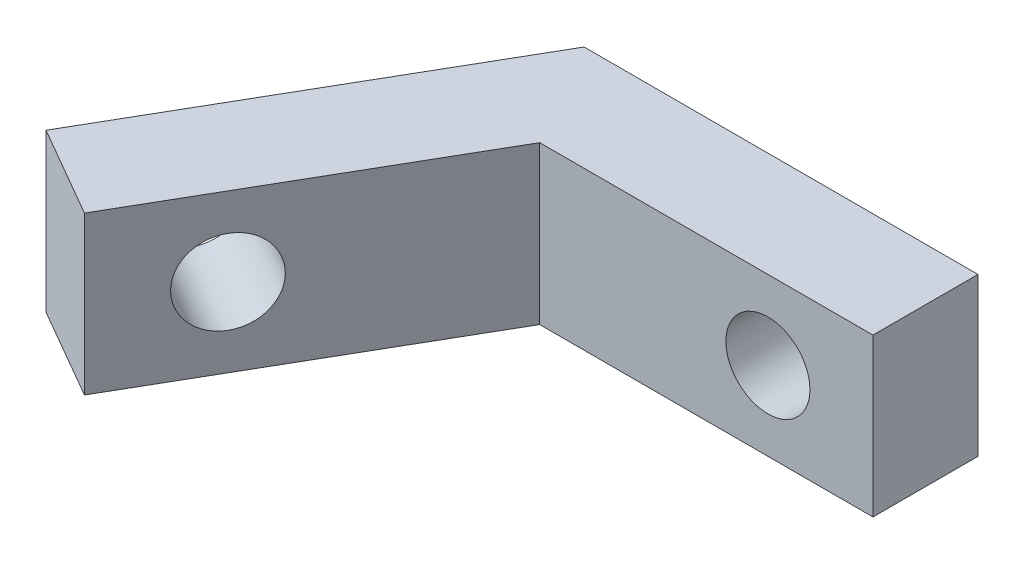
ISO-10303-21;
HEADER;
FILE_DESCRIPTION(('STEP AP214'),'2;1');
FILE_NAME('part.step','',(''),(''),'','','');
FILE_SCHEMA(('AUTOMOTIVE_DESIGN { 1 0 10303 214 1 1 1 1 }'));
ENDSEC;
DATA;
#1=APPLICATION_CONTEXT('core data for automotive mechanical design processes');
#2=APPLICATION_PROTOCOL_DEFINITION('international standard','automotive_design',2000,#1);
#3=PRODUCT_CONTEXT('',#1,'mechanical');
#4=PRODUCT('Part','Part','',(#3));
#5=PRODUCT_RELATED_PRODUCT_CATEGORY('part','',(#4));
#6=PRODUCT_DEFINITION_FORMATION('','',#4);
#7=PRODUCT_DEFINITION_CONTEXT('part definition',#1,'design');
#8=PRODUCT_DEFINITION('design','',#6,#7);
#9=PRODUCT_DEFINITION_SHAPE('','',#8);
#10=(LENGTH_UNIT() NAMED_UNIT(*) SI_UNIT(.MILLI.,.METRE.));
#11=(NAMED_UNIT(*) PLANE_ANGLE_UNIT() SI_UNIT($,.RADIAN.));
#12=(NAMED_UNIT(*) SI_UNIT($,.STERADIAN.) SOLID_ANGLE_UNIT());
#13=UNCERTAINTY_MEASURE_WITH_UNIT(LENGTH_MEASURE(1.E-05),#10,'distance_accuracy_value','');
#14=(GEOMETRIC_REPRESENTATION_CONTEXT(3) GLOBAL_UNCERTAINTY_ASSIGNED_CONTEXT((#13)) GLOBAL_UNIT_ASSIGNED_CONTEXT((#10,
#11,#12)) REPRESENTATION_CONTEXT('',''));
#15=CARTESIAN_POINT('',(0.,0.,0.));
#16=DIRECTION('',(0.,0.,1.));
#17=DIRECTION('',(1.,0.,0.));
#18=AXIS2_PLACEMENT_3D('',#15,#16,#17);
#19=CARTESIAN_POINT('',(-7.49999999999996,6.,12.9903810567666));
#20=DIRECTION('',(0.86602540378444,0.,0.499999999999998));
#21=DIRECTION('',(0.499999999999998,0.,-0.86602540378444));
#22=AXIS2_PLACEMENT_3D('',#19,#20,#21);
#23=PLANE('',#22);
#24=CARTESIAN_POINT('',(-5.49999999999997,3.,9.52627944162884));
#25=DIRECTION('',(0.86602540378444,0.,0.499999999999998));
#26=DIRECTION('',(0.499999999999998,0.,-0.86602540378444));
#27=AXIS2_PLACEMENT_3D('',#24,#25,#26);
#28=CIRCLE('',#27,1.6);
#29=CARTESIAN_POINT('',(-4.69999999999998,3.,8.14063879557373));
#30=VERTEX_POINT('',#29);
#31=EDGE_CURVE('E123',#30,#30,#28,.F.);
#32=ORIENTED_EDGE('',*,*,#31,.F.);
#33=EDGE_LOOP('',(#32));
#34=FACE_BOUND('',#33,.T.);
#35=DIRECTION('',(-0.499999999999998,0.,0.86602540378444));
#36=VECTOR('',#35,1.);
#37=CARTESIAN_POINT('',(-7.49999999999996,0.,12.9903810567666));
#38=LINE('',#37,#36);
#39=CARTESIAN_POINT('',(0.,0.,0.));
#40=VERTEX_POINT('',#39);
#41=CARTESIAN_POINT('',(-7.49999999999996,0.,12.9903810567666));
#42=VERTEX_POINT('',#41);
#43=EDGE_CURVE('E119',#40,#42,#38,.T.);
#44=ORIENTED_EDGE('',*,*,#43,.T.);
#45=DIRECTION('',(0.,-1.,0.));
#46=VECTOR('',#45,1.);
#47=CARTESIAN_POINT('',(-7.49999999999996,6.,12.9903810567666));
#48=LINE('',#47,#46);
#49=CARTESIAN_POINT('',(-7.49999999999996,6.,12.9903810567666));
#50=VERTEX_POINT('',#49);
#51=EDGE_CURVE('E11',#50,#42,#48,.T.);
#52=ORIENTED_EDGE('',*,*,#51,.F.);
#53=DIRECTION('',(-0.499999999999998,0.,0.86602540378444));
#54=VECTOR('',#53,1.);
#55=CARTESIAN_POINT('',(-7.49999999999996,6.,12.9903810567666));
#56=LINE('',#55,#54);
#57=CARTESIAN_POINT('',(0.,6.,0.));
#58=VERTEX_POINT('',#57);
#59=EDGE_CURVE('E130',#58,#50,#56,.T.);
#60=ORIENTED_EDGE('',*,*,#59,.F.);
#61=DIRECTION('',(0.,-1.,0.));
#62=VECTOR('',#61,1.);
#63=CARTESIAN_POINT('',(0.,6.,0.));
#64=LINE('',#63,#62);
#65=EDGE_CURVE('E115',#58,#40,#64,.T.);
#66=ORIENTED_EDGE('',*,*,#65,.T.);
#67=EDGE_LOOP('',(#44,#52,#60,#66));
#68=FACE_BOUND('',#67,.T.);
#69=ADVANCED_FACE('F34',(#34,#68),#23,.F.);
#70=CARTESIAN_POINT('',(-4.0358983848622,6.,14.9903810567666));
#71=DIRECTION('',(0.499999999999997,0.,-0.86602540378444));
#72=DIRECTION('',(-0.86602540378444,0.,-0.499999999999997));
#73=AXIS2_PLACEMENT_3D('',#70,#71,#72);
#74=PLANE('',#73);
#75=DIRECTION('',(0.86602540378444,0.,0.499999999999997));
#76=VECTOR('',#75,1.);
#77=CARTESIAN_POINT('',(-4.0358983848622,0.,14.9903810567666));
#78=LINE('',#77,#76);
#79=CARTESIAN_POINT('',(-4.0358983848622,0.,14.9903810567666));
#80=VERTEX_POINT('',#79);
#81=EDGE_CURVE('E122',#42,#80,#78,.T.);
#82=ORIENTED_EDGE('',*,*,#81,.T.);
#83=DIRECTION('',(0.,-1.,0.));
#84=VECTOR('',#83,1.);
#85=CARTESIAN_POINT('',(-4.0358983848622,6.,14.9903810567666));
#86=LINE('',#85,#84);
#87=CARTESIAN_POINT('',(-4.0358983848622,6.,14.9903810567666));
#88=VERTEX_POINT('',#87);
#89=EDGE_CURVE('E43',#88,#80,#86,.T.);
#90=ORIENTED_EDGE('',*,*,#89,.F.);
#91=DIRECTION('',(0.86602540378444,0.,0.499999999999997));
#92=VECTOR('',#91,1.);
#93=CARTESIAN_POINT('',(-4.0358983848622,6.,14.9903810567666));
#94=LINE('',#93,#92);
#95=EDGE_CURVE('E88',#50,#88,#94,.T.);
#96=ORIENTED_EDGE('',*,*,#95,.F.);
#97=ORIENTED_EDGE('',*,*,#51,.T.);
#98=EDGE_LOOP('',(#82,#90,#96,#97));
#99=FACE_BOUND('',#98,.T.);
#100=ADVANCED_FACE('F157',(#99),#74,.F.);
#101=CARTESIAN_POINT('',(2.30940107675851,6.,4.));
#102=DIRECTION('',(-0.86602540378444,0.,-0.499999999999998));
#103=DIRECTION('',(-0.499999999999998,0.,0.86602540378444));
#104=AXIS2_PLACEMENT_3D('',#101,#102,#103);
#105=PLANE('',#104);
#106=CARTESIAN_POINT('',(-2.03589838486221,3.,11.5262794416288));
#107=DIRECTION('',(-0.86602540378444,0.,-0.499999999999998));
#108=DIRECTION('',(-0.499999999999998,0.,0.86602540378444));
#109=AXIS2_PLACEMENT_3D('',#106,#107,#108);
#110=CIRCLE('',#109,1.6);
#111=CARTESIAN_POINT('',(-2.83589838486221,3.,12.9119200876839));
#112=VERTEX_POINT('',#111);
#113=EDGE_CURVE('E165',#112,#112,#110,.F.);
#114=ORIENTED_EDGE('',*,*,#113,.F.);
#115=EDGE_LOOP('',(#114));
#116=FACE_BOUND('',#115,.T.);
#117=DIRECTION('',(0.499999999999998,0.,-0.86602540378444));
#118=VECTOR('',#117,1.);
#119=CARTESIAN_POINT('',(2.30940107675851,0.,4.));
#120=LINE('',#119,#118);
#121=CARTESIAN_POINT('',(2.30940107675851,0.,4.));
#122=VERTEX_POINT('',#121);
#123=EDGE_CURVE('E125',#80,#122,#120,.T.);
#124=ORIENTED_EDGE('',*,*,#123,.T.);
#125=DIRECTION('',(0.,-1.,0.));
#126=VECTOR('',#125,1.);
#127=CARTESIAN_POINT('',(2.30940107675851,6.,4.));
#128=LINE('',#127,#126);
#129=CARTESIAN_POINT('',(2.30940107675851,6.,4.));
#130=VERTEX_POINT('',#129);
#131=EDGE_CURVE('E110',#130,#122,#128,.T.);
#132=ORIENTED_EDGE('',*,*,#131,.F.);
#133=DIRECTION('',(0.499999999999998,0.,-0.86602540378444));
#134=VECTOR('',#133,1.);
#135=CARTESIAN_POINT('',(2.30940107675851,6.,4.));
#136=LINE('',#135,#134);
#137=EDGE_CURVE('E101',#88,#130,#136,.T.);
#138=ORIENTED_EDGE('',*,*,#137,.F.);
#139=ORIENTED_EDGE('',*,*,#89,.T.);
#140=EDGE_LOOP('',(#124,#132,#138,#139));
#141=FACE_BOUND('',#140,.T.);
#142=ADVANCED_FACE('F137',(#116,#141),#105,.F.);
#143=CARTESIAN_POINT('',(15.,6.,4.));
#144=DIRECTION('',(0.,0.,-1.));
#145=DIRECTION('',(-1.,0.,0.));
#146=AXIS2_PLACEMENT_3D('',#143,#144,#145);
#147=PLANE('',#146);
#148=CARTESIAN_POINT('',(11.,3.,4.));
#149=DIRECTION('',(0.,0.,-1.));
#150=DIRECTION('',(-1.,0.,0.));
#151=AXIS2_PLACEMENT_3D('',#148,#149,#150);
#152=CIRCLE('',#151,1.6);
#153=CARTESIAN_POINT('',(12.6,3.,4.));
#154=VERTEX_POINT('',#153);
#155=EDGE_CURVE('E172',#154,#154,#152,.T.);
#156=ORIENTED_EDGE('',*,*,#155,.T.);
#157=EDGE_LOOP('',(#156));
#158=FACE_BOUND('',#157,.T.);
#159=DIRECTION('',(1.,0.,0.));
#160=VECTOR('',#159,1.);
#161=CARTESIAN_POINT('',(15.,0.,4.));
#162=LINE('',#161,#160);
#163=CARTESIAN_POINT('',(15.,0.,4.));
#164=VERTEX_POINT('',#163);
#165=EDGE_CURVE('E109',#122,#164,#162,.T.);
#166=ORIENTED_EDGE('',*,*,#165,.T.);
#167=DIRECTION('',(0.,-1.,0.));
#168=VECTOR('',#167,1.);
#169=CARTESIAN_POINT('',(15.,6.,4.));
#170=LINE('',#169,#168);
#171=CARTESIAN_POINT('',(15.,6.,4.));
#172=VERTEX_POINT('',#171);
#173=EDGE_CURVE('E106',#172,#164,#170,.T.);
#174=ORIENTED_EDGE('',*,*,#173,.F.);
#175=DIRECTION('',(1.,0.,0.));
#176=VECTOR('',#175,1.);
#177=CARTESIAN_POINT('',(15.,6.,4.));
#178=LINE('',#177,#176);
#179=EDGE_CURVE('E95',#130,#172,#178,.T.);
#180=ORIENTED_EDGE('',*,*,#179,.F.);
#181=ORIENTED_EDGE('',*,*,#131,.T.);
#182=EDGE_LOOP('',(#166,#174,#180,#181));
#183=FACE_BOUND('',#182,.T.);
#184=ADVANCED_FACE('F107',(#158,#183),#147,.F.);
#185=CARTESIAN_POINT('',(15.,6.,0.));
#186=DIRECTION('',(-1.,0.,0.));
#187=DIRECTION('',(0.,0.,1.));
#188=AXIS2_PLACEMENT_3D('',#185,#186,#187);
#189=PLANE('',#188);
#190=DIRECTION('',(0.,0.,-1.));
#191=VECTOR('',#190,1.);
#192=CARTESIAN_POINT('',(15.,0.,0.));
#193=LINE('',#192,#191);
#194=CARTESIAN_POINT('',(15.,0.,0.));
#195=VERTEX_POINT('',#194);
#196=EDGE_CURVE('E74',#164,#195,#193,.T.);
#197=ORIENTED_EDGE('',*,*,#196,.T.);
#198=DIRECTION('',(0.,-1.,0.));
#199=VECTOR('',#198,1.);
#200=CARTESIAN_POINT('',(15.,6.,0.));
#201=LINE('',#200,#199);
#202=CARTESIAN_POINT('',(15.,6.,0.));
#203=VERTEX_POINT('',#202);
#204=EDGE_CURVE('E111',#203,#195,#201,.T.);
#205=ORIENTED_EDGE('',*,*,#204,.F.);
#206=DIRECTION('',(0.,0.,-1.));
#207=VECTOR('',#206,1.);
#208=CARTESIAN_POINT('',(15.,6.,0.));
#209=LINE('',#208,#207);
#210=EDGE_CURVE('E99',#172,#203,#209,.T.);
#211=ORIENTED_EDGE('',*,*,#210,.F.);
#212=ORIENTED_EDGE('',*,*,#173,.T.);
#213=EDGE_LOOP('',(#197,#205,#211,#212));
#214=FACE_BOUND('',#213,.T.);
#215=ADVANCED_FACE('F113',(#214),#189,.F.);
#216=CARTESIAN_POINT('',(0.,6.,0.));
#217=DIRECTION('',(0.,0.,1.));
#218=DIRECTION('',(1.,0.,0.));
#219=AXIS2_PLACEMENT_3D('',#216,#217,#218);
#220=PLANE('',#219);
#221=CARTESIAN_POINT('',(11.,3.,0.));
#222=DIRECTION('',(0.,0.,1.));
#223=DIRECTION('',(1.,0.,0.));
#224=AXIS2_PLACEMENT_3D('',#221,#222,#223);
#225=CIRCLE('',#224,1.6);
#226=CARTESIAN_POINT('',(12.6,3.,0.));
#227=VERTEX_POINT('',#226);
#228=EDGE_CURVE('E37',#227,#227,#225,.T.);
#229=ORIENTED_EDGE('',*,*,#228,.T.);
#230=EDGE_LOOP('',(#229));
#231=FACE_BOUND('',#230,.T.);
#232=DIRECTION('',(-1.,0.,0.));
#233=VECTOR('',#232,1.);
#234=CARTESIAN_POINT('',(0.,0.,0.));
#235=LINE('',#234,#233);
#236=EDGE_CURVE('E80',#195,#40,#235,.T.);
#237=ORIENTED_EDGE('',*,*,#236,.T.);
#238=ORIENTED_EDGE('',*,*,#65,.F.);
#239=DIRECTION('',(-1.,0.,0.));
#240=VECTOR('',#239,1.);
#241=CARTESIAN_POINT('',(0.,6.,0.));
#242=LINE('',#241,#240);
#243=EDGE_CURVE('E51',#203,#58,#242,.T.);
#244=ORIENTED_EDGE('',*,*,#243,.F.);
#245=ORIENTED_EDGE('',*,*,#204,.T.);
#246=EDGE_LOOP('',(#237,#238,#244,#245));
#247=FACE_BOUND('',#246,.T.);
#248=ADVANCED_FACE('F144',(#231,#247),#220,.F.);
#249=CARTESIAN_POINT('',(0.,6.,0.));
#250=DIRECTION('',(0.,1.,0.));
#251=DIRECTION('',(0.,0.,1.));
#252=AXIS2_PLACEMENT_3D('',#249,#250,#251);
#253=PLANE('',#252);
#254=ORIENTED_EDGE('',*,*,#59,.T.);
#255=ORIENTED_EDGE('',*,*,#95,.T.);
#256=ORIENTED_EDGE('',*,*,#137,.T.);
#257=ORIENTED_EDGE('',*,*,#179,.T.);
#258=ORIENTED_EDGE('',*,*,#210,.T.);
#259=ORIENTED_EDGE('',*,*,#243,.T.);
#260=EDGE_LOOP('',(#254,#255,#256,#257,#258,#259));
#261=FACE_BOUND('',#260,.T.);
#262=ADVANCED_FACE('F97',(#261),#253,.T.);
#263=CARTESIAN_POINT('',(0.,0.,0.));
#264=DIRECTION('',(0.,1.,0.));
#265=DIRECTION('',(0.,0.,1.));
#266=AXIS2_PLACEMENT_3D('',#263,#264,#265);
#267=PLANE('',#266);
#268=ORIENTED_EDGE('',*,*,#43,.F.);
#269=ORIENTED_EDGE('',*,*,#236,.F.);
#270=ORIENTED_EDGE('',*,*,#196,.F.);
#271=ORIENTED_EDGE('',*,*,#165,.F.);
#272=ORIENTED_EDGE('',*,*,#123,.F.);
#273=ORIENTED_EDGE('',*,*,#81,.F.);
#274=EDGE_LOOP('',(#268,#269,#270,#271,#272,#273));
#275=FACE_BOUND('',#274,.T.);
#276=ADVANCED_FACE('F140',(#275),#267,.F.);
#277=CARTESIAN_POINT('',(-11.125,3.,6.27868417743722));
#278=DIRECTION('',(0.86602540378444,0.,0.499999999999998));
#279=DIRECTION('',(0.499999999999998,0.,-0.86602540378444));
#280=AXIS2_PLACEMENT_3D('',#277,#278,#279);
#281=CYLINDRICAL_SURFACE('',#280,1.6);
#282=ORIENTED_EDGE('',*,*,#113,.T.);
#283=EDGE_LOOP('',(#282));
#284=FACE_BOUND('',#283,.T.);
#285=ORIENTED_EDGE('',*,*,#31,.T.);
#286=EDGE_LOOP('',(#285));
#287=FACE_BOUND('',#286,.T.);
#288=ADVANCED_FACE('F180',(#284,#287),#281,.F.);
#289=CARTESIAN_POINT('',(11.,3.,-1.19999999991326E-05));
#290=DIRECTION('',(0.,0.,1.));
#291=DIRECTION('',(1.,0.,0.));
#292=AXIS2_PLACEMENT_3D('',#289,#290,#291);
#293=CYLINDRICAL_SURFACE('',#292,1.6);
#294=CARTESIAN_POINT('',(12.6,3.,4.));
#295=CARTESIAN_POINT('',(12.6,3.,3.95833333333333));
#296=CARTESIAN_POINT('',(12.6,3.,3.91666666666667));
#297=CARTESIAN_POINT('',(12.6,3.,3.83333333333333));
#298=CARTESIAN_POINT('',(12.6,3.,3.79166666666667));
#299=CARTESIAN_POINT('',(12.6,3.,3.70833333333333));
#300=CARTESIAN_POINT('',(12.6,3.,3.66666666666667));
#301=CARTESIAN_POINT('',(12.6,3.,3.58333333333333));
#302=CARTESIAN_POINT('',(12.6,3.,3.54166666666667));
#303=CARTESIAN_POINT('',(12.6,3.,3.45833333333333));
#304=CARTESIAN_POINT('',(12.6,3.,3.41666666666667));
#305=CARTESIAN_POINT('',(12.6,3.,3.33333333333333));
#306=CARTESIAN_POINT('',(12.6,3.,3.29166666666667));
#307=CARTESIAN_POINT('',(12.6,3.,3.20833333333333));
#308=CARTESIAN_POINT('',(12.6,3.,3.16666666666667));
#309=CARTESIAN_POINT('',(12.6,3.,3.08333333333333));
#310=CARTESIAN_POINT('',(12.6,3.,3.04166666666667));
#311=CARTESIAN_POINT('',(12.6,3.,2.95833333333333));
#312=CARTESIAN_POINT('',(12.6,3.,2.91666666666667));
#313=CARTESIAN_POINT('',(12.6,3.,2.83333333333333));
#314=CARTESIAN_POINT('',(12.6,3.,2.79166666666667));
#315=CARTESIAN_POINT('',(12.6,3.,2.70833333333333));
#316=CARTESIAN_POINT('',(12.6,3.,2.66666666666667));
#317=CARTESIAN_POINT('',(12.6,3.,2.58333333333333));
#318=CARTESIAN_POINT('',(12.6,3.,2.54166666666667));
#319=CARTESIAN_POINT('',(12.6,3.,2.45833333333333));
#320=CARTESIAN_POINT('',(12.6,3.,2.41666666666667));
#321=CARTESIAN_POINT('',(12.6,3.,2.33333333333333));
#322=CARTESIAN_POINT('',(12.6,3.,2.29166666666667));
#323=CARTESIAN_POINT('',(12.6,3.,2.20833333333333));
#324=CARTESIAN_POINT('',(12.6,3.,2.16666666666667));
#325=CARTESIAN_POINT('',(12.6,3.,2.08333333333333));
#326=CARTESIAN_POINT('',(12.6,3.,2.04166666666667));
#327=CARTESIAN_POINT('',(12.6,3.,1.95833333333333));
#328=CARTESIAN_POINT('',(12.6,3.,1.91666666666667));
#329=CARTESIAN_POINT('',(12.6,3.,1.83333333333333));
#330=CARTESIAN_POINT('',(12.6,3.,1.79166666666667));
#331=CARTESIAN_POINT('',(12.6,3.,1.70833333333333));
#332=CARTESIAN_POINT('',(12.6,3.,1.66666666666667));
#333=CARTESIAN_POINT('',(12.6,3.,1.58333333333333));
#334=CARTESIAN_POINT('',(12.6,3.,1.54166666666667));
#335=CARTESIAN_POINT('',(12.6,3.,1.45833333333333));
#336=CARTESIAN_POINT('',(12.6,3.,1.41666666666667));
#337=CARTESIAN_POINT('',(12.6,3.,1.33333333333333));
#338=CARTESIAN_POINT('',(12.6,3.,1.29166666666667));
#339=CARTESIAN_POINT('',(12.6,3.,1.20833333333333));
#340=CARTESIAN_POINT('',(12.6,3.,1.16666666666667));
#341=CARTESIAN_POINT('',(12.6,3.,1.08333333333333));
#342=CARTESIAN_POINT('',(12.6,3.,1.04166666666667));
#343=CARTESIAN_POINT('',(12.6,3.,0.958333333333333));
#344=CARTESIAN_POINT('',(12.6,3.,0.916666666666667));
#345=CARTESIAN_POINT('',(12.6,3.,0.833333333333333));
#346=CARTESIAN_POINT('',(12.6,3.,0.791666666666667));
#347=CARTESIAN_POINT('',(12.6,3.,0.708333333333333));
#348=CARTESIAN_POINT('',(12.6,3.,0.666666666666667));
#349=CARTESIAN_POINT('',(12.6,3.,0.583333333333333));
#350=CARTESIAN_POINT('',(12.6,3.,0.541666666666667));
#351=CARTESIAN_POINT('',(12.6,3.,0.458333333333333));
#352=CARTESIAN_POINT('',(12.6,3.,0.416666666666667));
#353=CARTESIAN_POINT('',(12.6,3.,0.333333333333333));
#354=CARTESIAN_POINT('',(12.6,3.,0.291666666666667));
#355=CARTESIAN_POINT('',(12.6,3.,0.208333333333334));
#356=CARTESIAN_POINT('',(12.6,3.,0.166666666666667));
#357=CARTESIAN_POINT('',(12.6,3.,0.0833333333333336));
#358=CARTESIAN_POINT('',(12.6,3.,0.0416666666666668));
#359=CARTESIAN_POINT('',(12.6,3.,0.));
#360=B_SPLINE_CURVE_WITH_KNOTS('',3,(#294,#295,#296,#297,#298,#299,#300,#301,#302,#303,#304,
#305,#306,#307,#308,#309,#310,#311,#312,#313,#314,#315,#316,#317,#318,#319,#320,#321,#322,#323,
#324,#325,#326,#327,#328,#329,#330,#331,#332,#333,#334,#335,#336,#337,#338,#339,#340,#341,#342,
#343,#344,#345,#346,#347,#348,#349,#350,#351,#352,#353,#354,#355,#356,#357,#358,#359),
.UNSPECIFIED.,.F.,.F.,(4,2,2,2,2,2,2,2,2,2,2,2,2,2,2,2,2,2,2,2,2,2,2,2,2,2,2,2,2,2,2,2,4),(0.,
0.125,0.25,0.374999999999999,0.5,0.625,0.749999999999999,0.874999999999999,1.,1.125,1.25,1.375,
1.5,1.625,1.75,1.875,2.,2.125,2.25,2.375,2.5,2.625,2.75,2.875,3.,3.125,3.25,3.375,3.5,3.625,
3.75,3.875,4.),.UNSPECIFIED.);
#361=EDGE_CURVE('BSEAM178',#154,#227,#360,.T.);
#362=ORIENTED_EDGE('',*,*,#155,.F.);
#363=ORIENTED_EDGE('',*,*,#228,.F.);
#364=ORIENTED_EDGE('',*,*,#361,.T.);
#365=ORIENTED_EDGE('',*,*,#361,.F.);
#366=EDGE_LOOP('',(#362,#364,#363,#365));
#367=FACE_BOUND('',#366,.T.);
#368=ADVANCED_FACE('F178',(#367),#293,.F.);
#369=CLOSED_SHELL('',(#69,#100,#142,#184,#215,#248,#262,#276,#288,#368));
#370=MANIFOLD_SOLID_BREP('B2',#369);
#371=ADVANCED_BREP_SHAPE_REPRESENTATION('',(#18,#370),#14);
#372=SHAPE_DEFINITION_REPRESENTATION(#9,#371);
ENDSEC;
END-ISO-10303-21;
